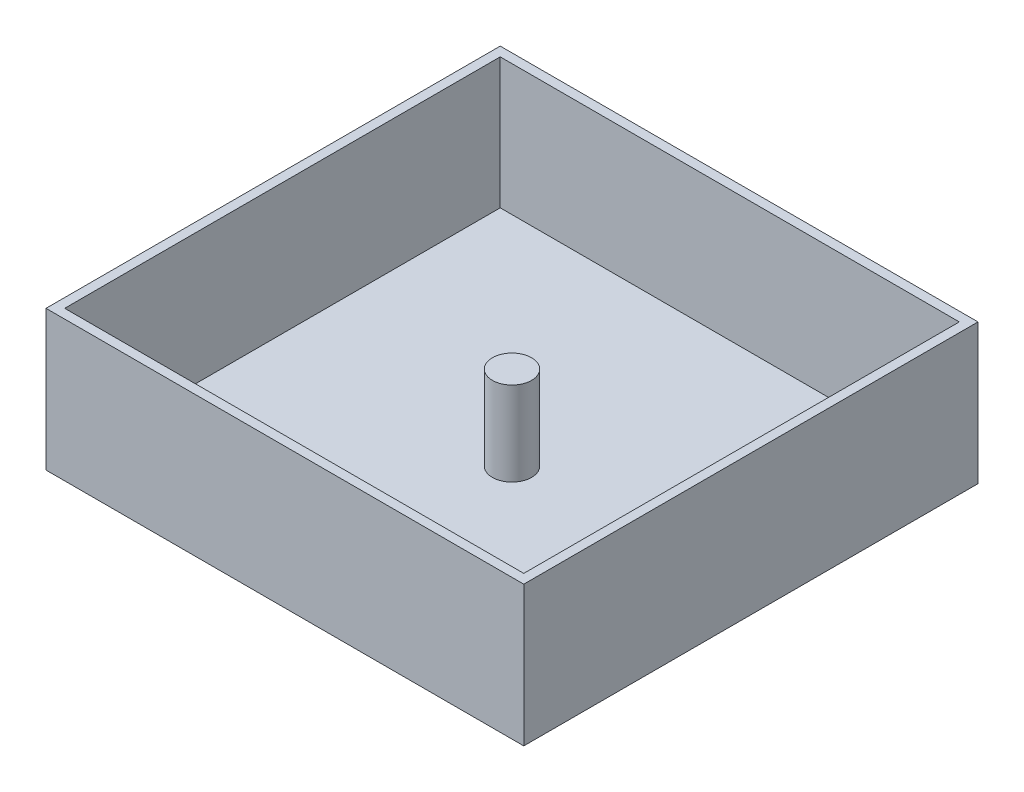
ISO-10303-21;
HEADER;
FILE_DESCRIPTION(('STEP AP214'),'2;1');
FILE_NAME('part.step','',(''),(''),'','','');
FILE_SCHEMA(('AUTOMOTIVE_DESIGN { 1 0 10303 214 1 1 1 1 }'));
ENDSEC;
DATA;
#1=APPLICATION_CONTEXT('core data for automotive mechanical design processes');
#2=APPLICATION_PROTOCOL_DEFINITION('international standard','automotive_design',2000,#1);
#3=PRODUCT_CONTEXT('',#1,'mechanical');
#4=PRODUCT('Part','Part','',(#3));
#5=PRODUCT_RELATED_PRODUCT_CATEGORY('part','',(#4));
#6=PRODUCT_DEFINITION_FORMATION('','',#4);
#7=PRODUCT_DEFINITION_CONTEXT('part definition',#1,'design');
#8=PRODUCT_DEFINITION('design','',#6,#7);
#9=PRODUCT_DEFINITION_SHAPE('','',#8);
#10=(LENGTH_UNIT() NAMED_UNIT(*) SI_UNIT(.MILLI.,.METRE.));
#11=(NAMED_UNIT(*) PLANE_ANGLE_UNIT() SI_UNIT($,.RADIAN.));
#12=(NAMED_UNIT(*) SI_UNIT($,.STERADIAN.) SOLID_ANGLE_UNIT());
#13=UNCERTAINTY_MEASURE_WITH_UNIT(LENGTH_MEASURE(1.E-05),#10,'distance_accuracy_value','');
#14=(GEOMETRIC_REPRESENTATION_CONTEXT(3) GLOBAL_UNCERTAINTY_ASSIGNED_CONTEXT((#13)) GLOBAL_UNIT_ASSIGNED_CONTEXT((#10,
#11,#12)) REPRESENTATION_CONTEXT('',''));
#15=CARTESIAN_POINT('',(0.,0.,0.));
#16=DIRECTION('',(0.,0.,1.));
#17=DIRECTION('',(1.,0.,0.));
#18=AXIS2_PLACEMENT_3D('',#15,#16,#17);
#19=CARTESIAN_POINT('',(76.7295,45.,-72.948));
#20=DIRECTION('',(-1.,0.,0.));
#21=DIRECTION('',(0.,0.,1.));
#22=AXIS2_PLACEMENT_3D('',#19,#20,#21);
#23=PLANE('',#22);
#24=DIRECTION('',(0.,0.,-1.));
#25=VECTOR('',#24,1.);
#26=CARTESIAN_POINT('',(76.7295,0.,-72.948));
#27=LINE('',#26,#25);
#28=CARTESIAN_POINT('',(76.7295,0.,72.948));
#29=VERTEX_POINT('',#28);
#30=CARTESIAN_POINT('',(76.7295,0.,-72.948));
#31=VERTEX_POINT('',#30);
#32=EDGE_CURVE('E148',#29,#31,#27,.T.);
#33=ORIENTED_EDGE('',*,*,#32,.T.);
#34=DIRECTION('',(0.,-1.,0.));
#35=VECTOR('',#34,1.);
#36=CARTESIAN_POINT('',(76.7295,45.,-72.948));
#37=LINE('',#36,#35);
#38=CARTESIAN_POINT('',(76.7295,45.,-72.948));
#39=VERTEX_POINT('',#38);
#40=EDGE_CURVE('E11',#39,#31,#37,.T.);
#41=ORIENTED_EDGE('',*,*,#40,.F.);
#42=DIRECTION('',(0.,0.,-1.));
#43=VECTOR('',#42,1.);
#44=CARTESIAN_POINT('',(76.7295,45.,-72.948));
#45=LINE('',#44,#43);
#46=CARTESIAN_POINT('',(76.7295,45.,72.948));
#47=VERTEX_POINT('',#46);
#48=EDGE_CURVE('E141',#47,#39,#45,.T.);
#49=ORIENTED_EDGE('',*,*,#48,.F.);
#50=DIRECTION('',(0.,-1.,0.));
#51=VECTOR('',#50,1.);
#52=CARTESIAN_POINT('',(76.7295,45.,72.948));
#53=LINE('',#52,#51);
#54=EDGE_CURVE('E147',#47,#29,#53,.T.);
#55=ORIENTED_EDGE('',*,*,#54,.T.);
#56=EDGE_LOOP('',(#33,#41,#49,#55));
#57=FACE_BOUND('',#56,.T.);
#58=ADVANCED_FACE('F34',(#57),#23,.F.);
#59=CARTESIAN_POINT('',(-76.7295,45.,-72.948));
#60=DIRECTION('',(0.,0.,1.));
#61=DIRECTION('',(1.,0.,0.));
#62=AXIS2_PLACEMENT_3D('',#59,#60,#61);
#63=PLANE('',#62);
#64=DIRECTION('',(-1.,0.,0.));
#65=VECTOR('',#64,1.);
#66=CARTESIAN_POINT('',(-76.7295,0.,-72.948));
#67=LINE('',#66,#65);
#68=CARTESIAN_POINT('',(-76.7295,0.,-72.948));
#69=VERTEX_POINT('',#68);
#70=EDGE_CURVE('E151',#31,#69,#67,.T.);
#71=ORIENTED_EDGE('',*,*,#70,.T.);
#72=DIRECTION('',(0.,-1.,0.));
#73=VECTOR('',#72,1.);
#74=CARTESIAN_POINT('',(-76.7295,45.,-72.948));
#75=LINE('',#74,#73);
#76=CARTESIAN_POINT('',(-76.7295,45.,-72.948));
#77=VERTEX_POINT('',#76);
#78=EDGE_CURVE('E41',#77,#69,#75,.T.);
#79=ORIENTED_EDGE('',*,*,#78,.F.);
#80=DIRECTION('',(-1.,0.,0.));
#81=VECTOR('',#80,1.);
#82=CARTESIAN_POINT('',(-76.7295,45.,-72.948));
#83=LINE('',#82,#81);
#84=EDGE_CURVE('E85',#39,#77,#83,.T.);
#85=ORIENTED_EDGE('',*,*,#84,.F.);
#86=ORIENTED_EDGE('',*,*,#40,.T.);
#87=EDGE_LOOP('',(#71,#79,#85,#86));
#88=FACE_BOUND('',#87,.T.);
#89=ADVANCED_FACE('F180',(#88),#63,.F.);
#90=CARTESIAN_POINT('',(-76.7295,45.,-72.948));
#91=DIRECTION('',(1.,0.,0.));
#92=DIRECTION('',(0.,0.,-1.));
#93=AXIS2_PLACEMENT_3D('',#90,#91,#92);
#94=PLANE('',#93);
#95=DIRECTION('',(0.,0.,1.));
#96=VECTOR('',#95,1.);
#97=CARTESIAN_POINT('',(-76.7295,0.,-72.948));
#98=LINE('',#97,#96);
#99=CARTESIAN_POINT('',(-76.7295,0.,72.948));
#100=VERTEX_POINT('',#99);
#101=EDGE_CURVE('E153',#69,#100,#98,.T.);
#102=ORIENTED_EDGE('',*,*,#101,.T.);
#103=DIRECTION('',(0.,-1.,0.));
#104=VECTOR('',#103,1.);
#105=CARTESIAN_POINT('',(-76.7295,45.,72.948));
#106=LINE('',#105,#104);
#107=CARTESIAN_POINT('',(-76.7295,45.,72.948));
#108=VERTEX_POINT('',#107);
#109=EDGE_CURVE('E157',#108,#100,#106,.T.);
#110=ORIENTED_EDGE('',*,*,#109,.F.);
#111=DIRECTION('',(0.,0.,1.));
#112=VECTOR('',#111,1.);
#113=CARTESIAN_POINT('',(-76.7295,45.,-72.948));
#114=LINE('',#113,#112);
#115=EDGE_CURVE('E144',#77,#108,#114,.T.);
#116=ORIENTED_EDGE('',*,*,#115,.F.);
#117=ORIENTED_EDGE('',*,*,#78,.T.);
#118=EDGE_LOOP('',(#102,#110,#116,#117));
#119=FACE_BOUND('',#118,.T.);
#120=ADVANCED_FACE('F162',(#119),#94,.F.);
#121=CARTESIAN_POINT('',(-76.7295,45.,72.948));
#122=DIRECTION('',(0.,0.,-1.));
#123=DIRECTION('',(-1.,0.,0.));
#124=AXIS2_PLACEMENT_3D('',#121,#122,#123);
#125=PLANE('',#124);
#126=DIRECTION('',(1.,0.,0.));
#127=VECTOR('',#126,1.);
#128=CARTESIAN_POINT('',(-76.7295,0.,72.948));
#129=LINE('',#128,#127);
#130=EDGE_CURVE('E78',#100,#29,#129,.T.);
#131=ORIENTED_EDGE('',*,*,#130,.T.);
#132=ORIENTED_EDGE('',*,*,#54,.F.);
#133=DIRECTION('',(1.,0.,0.));
#134=VECTOR('',#133,1.);
#135=CARTESIAN_POINT('',(-76.7295,45.,72.948));
#136=LINE('',#135,#134);
#137=EDGE_CURVE('E57',#108,#47,#136,.T.);
#138=ORIENTED_EDGE('',*,*,#137,.F.);
#139=ORIENTED_EDGE('',*,*,#109,.T.);
#140=EDGE_LOOP('',(#131,#132,#138,#139));
#141=FACE_BOUND('',#140,.T.);
#142=ADVANCED_FACE('F170',(#141),#125,.F.);
#143=CARTESIAN_POINT('',(0.,45.,0.));
#144=DIRECTION('',(0.,1.,0.));
#145=DIRECTION('',(0.,0.,1.));
#146=AXIS2_PLACEMENT_3D('',#143,#144,#145);
#147=PLANE('',#146);
#148=DIRECTION('',(0.,0.,-1.));
#149=VECTOR('',#148,1.);
#150=CARTESIAN_POINT('',(73.7295,45.,-72.948));
#151=LINE('',#150,#149);
#152=CARTESIAN_POINT('',(73.7295,45.,69.948));
#153=VERTEX_POINT('',#152);
#154=CARTESIAN_POINT('',(73.7295,45.,-69.948));
#155=VERTEX_POINT('',#154);
#156=EDGE_CURVE('E130',#153,#155,#151,.T.);
#157=ORIENTED_EDGE('',*,*,#156,.F.);
#158=DIRECTION('',(1.,0.,0.));
#159=VECTOR('',#158,1.);
#160=CARTESIAN_POINT('',(-76.7295,45.,69.948));
#161=LINE('',#160,#159);
#162=CARTESIAN_POINT('',(-73.7295,45.,69.948));
#163=VERTEX_POINT('',#162);
#164=EDGE_CURVE('E139',#163,#153,#161,.T.);
#165=ORIENTED_EDGE('',*,*,#164,.F.);
#166=DIRECTION('',(0.,0.,1.));
#167=VECTOR('',#166,1.);
#168=CARTESIAN_POINT('',(-73.7295,45.,-72.948));
#169=LINE('',#168,#167);
#170=CARTESIAN_POINT('',(-73.7295,45.,-69.948));
#171=VERTEX_POINT('',#170);
#172=EDGE_CURVE('E137',#171,#163,#169,.T.);
#173=ORIENTED_EDGE('',*,*,#172,.F.);
#174=DIRECTION('',(-1.,0.,0.));
#175=VECTOR('',#174,1.);
#176=CARTESIAN_POINT('',(-76.7295,45.,-69.948));
#177=LINE('',#176,#175);
#178=EDGE_CURVE('E122',#155,#171,#177,.T.);
#179=ORIENTED_EDGE('',*,*,#178,.F.);
#180=EDGE_LOOP('',(#157,#165,#173,#179));
#181=FACE_BOUND('',#180,.T.);
#182=ORIENTED_EDGE('',*,*,#48,.T.);
#183=ORIENTED_EDGE('',*,*,#84,.T.);
#184=ORIENTED_EDGE('',*,*,#115,.T.);
#185=ORIENTED_EDGE('',*,*,#137,.T.);
#186=EDGE_LOOP('',(#182,#183,#184,#185));
#187=FACE_BOUND('',#186,.T.);
#188=ADVANCED_FACE('F172',(#181,#187),#147,.T.);
#189=CARTESIAN_POINT('',(0.,0.,0.));
#190=DIRECTION('',(0.,1.,0.));
#191=DIRECTION('',(0.,0.,1.));
#192=AXIS2_PLACEMENT_3D('',#189,#190,#191);
#193=PLANE('',#192);
#194=ORIENTED_EDGE('',*,*,#32,.F.);
#195=ORIENTED_EDGE('',*,*,#130,.F.);
#196=ORIENTED_EDGE('',*,*,#101,.F.);
#197=ORIENTED_EDGE('',*,*,#70,.F.);
#198=EDGE_LOOP('',(#194,#195,#196,#197));
#199=FACE_BOUND('',#198,.T.);
#200=ADVANCED_FACE('F166',(#199),#193,.F.);
#201=CARTESIAN_POINT('',(73.7295,45.,-72.948));
#202=DIRECTION('',(-1.,0.,0.));
#203=DIRECTION('',(0.,0.,1.));
#204=AXIS2_PLACEMENT_3D('',#201,#202,#203);
#205=PLANE('',#204);
#206=DIRECTION('',(0.,0.,-1.));
#207=VECTOR('',#206,1.);
#208=CARTESIAN_POINT('',(73.7295,3.,-72.948));
#209=LINE('',#208,#207);
#210=CARTESIAN_POINT('',(73.7295,3.,69.948));
#211=VERTEX_POINT('',#210);
#212=CARTESIAN_POINT('',(73.7295,3.,-69.948));
#213=VERTEX_POINT('',#212);
#214=EDGE_CURVE('E113',#211,#213,#209,.T.);
#215=ORIENTED_EDGE('',*,*,#214,.F.);
#216=DIRECTION('',(0.,-1.,0.));
#217=VECTOR('',#216,1.);
#218=CARTESIAN_POINT('',(73.7295,45.,69.948));
#219=LINE('',#218,#217);
#220=EDGE_CURVE('E133',#153,#211,#219,.T.);
#221=ORIENTED_EDGE('',*,*,#220,.F.);
#222=ORIENTED_EDGE('',*,*,#156,.T.);
#223=DIRECTION('',(0.,-1.,0.));
#224=VECTOR('',#223,1.);
#225=CARTESIAN_POINT('',(73.7295,45.,-69.948));
#226=LINE('',#225,#224);
#227=EDGE_CURVE('E125',#155,#213,#226,.T.);
#228=ORIENTED_EDGE('',*,*,#227,.T.);
#229=EDGE_LOOP('',(#215,#221,#222,#228));
#230=FACE_BOUND('',#229,.T.);
#231=ADVANCED_FACE('F213',(#230),#205,.T.);
#232=CARTESIAN_POINT('',(-76.7295,45.,-69.948));
#233=DIRECTION('',(0.,0.,1.));
#234=DIRECTION('',(1.,0.,0.));
#235=AXIS2_PLACEMENT_3D('',#232,#233,#234);
#236=PLANE('',#235);
#237=DIRECTION('',(-1.,0.,0.));
#238=VECTOR('',#237,1.);
#239=CARTESIAN_POINT('',(-76.7295,3.,-69.948));
#240=LINE('',#239,#238);
#241=CARTESIAN_POINT('',(-73.7295,3.,-69.948));
#242=VERTEX_POINT('',#241);
#243=EDGE_CURVE('E107',#213,#242,#240,.T.);
#244=ORIENTED_EDGE('',*,*,#243,.F.);
#245=ORIENTED_EDGE('',*,*,#227,.F.);
#246=ORIENTED_EDGE('',*,*,#178,.T.);
#247=DIRECTION('',(0.,-1.,0.));
#248=VECTOR('',#247,1.);
#249=CARTESIAN_POINT('',(-73.7295,45.,-69.948));
#250=LINE('',#249,#248);
#251=EDGE_CURVE('E119',#171,#242,#250,.T.);
#252=ORIENTED_EDGE('',*,*,#251,.T.);
#253=EDGE_LOOP('',(#244,#245,#246,#252));
#254=FACE_BOUND('',#253,.T.);
#255=ADVANCED_FACE('F120',(#254),#236,.T.);
#256=CARTESIAN_POINT('',(-73.7295,45.,-72.948));
#257=DIRECTION('',(1.,0.,0.));
#258=DIRECTION('',(0.,0.,-1.));
#259=AXIS2_PLACEMENT_3D('',#256,#257,#258);
#260=PLANE('',#259);
#261=DIRECTION('',(0.,0.,1.));
#262=VECTOR('',#261,1.);
#263=CARTESIAN_POINT('',(-73.7295,3.,-72.948));
#264=LINE('',#263,#262);
#265=CARTESIAN_POINT('',(-73.7295,3.,69.948));
#266=VERTEX_POINT('',#265);
#267=EDGE_CURVE('E111',#242,#266,#264,.T.);
#268=ORIENTED_EDGE('',*,*,#267,.F.);
#269=ORIENTED_EDGE('',*,*,#251,.F.);
#270=ORIENTED_EDGE('',*,*,#172,.T.);
#271=DIRECTION('',(0.,-1.,0.));
#272=VECTOR('',#271,1.);
#273=CARTESIAN_POINT('',(-73.7295,45.,69.948));
#274=LINE('',#273,#272);
#275=EDGE_CURVE('E48',#163,#266,#274,.T.);
#276=ORIENTED_EDGE('',*,*,#275,.T.);
#277=EDGE_LOOP('',(#268,#269,#270,#276));
#278=FACE_BOUND('',#277,.T.);
#279=ADVANCED_FACE('F127',(#278),#260,.T.);
#280=CARTESIAN_POINT('',(-76.7295,45.,69.948));
#281=DIRECTION('',(0.,0.,-1.));
#282=DIRECTION('',(-1.,0.,0.));
#283=AXIS2_PLACEMENT_3D('',#280,#281,#282);
#284=PLANE('',#283);
#285=DIRECTION('',(1.,0.,0.));
#286=VECTOR('',#285,1.);
#287=CARTESIAN_POINT('',(-76.7295,3.,69.948));
#288=LINE('',#287,#286);
#289=EDGE_CURVE('E128',#266,#211,#288,.T.);
#290=ORIENTED_EDGE('',*,*,#289,.F.);
#291=ORIENTED_EDGE('',*,*,#275,.F.);
#292=ORIENTED_EDGE('',*,*,#164,.T.);
#293=ORIENTED_EDGE('',*,*,#220,.T.);
#294=EDGE_LOOP('',(#290,#291,#292,#293));
#295=FACE_BOUND('',#294,.T.);
#296=ADVANCED_FACE('F238',(#295),#284,.T.);
#297=CARTESIAN_POINT('',(0.,3.,0.));
#298=DIRECTION('',(0.,1.,0.));
#299=DIRECTION('',(0.,0.,1.));
#300=AXIS2_PLACEMENT_3D('',#297,#298,#299);
#301=PLANE('',#300);
#302=CARTESIAN_POINT('',(0.,3.,0.));
#303=DIRECTION('',(0.,1.,0.));
#304=DIRECTION('',(0.,0.,1.));
#305=AXIS2_PLACEMENT_3D('',#302,#303,#304);
#306=CIRCLE('',#305,6.3);
#307=CARTESIAN_POINT('',(0.,3.,-6.3));
#308=VERTEX_POINT('',#307);
#309=EDGE_CURVE('E282',#308,#308,#306,.T.);
#310=ORIENTED_EDGE('',*,*,#309,.F.);
#311=EDGE_LOOP('',(#310));
#312=FACE_BOUND('',#311,.T.);
#313=ORIENTED_EDGE('',*,*,#214,.T.);
#314=ORIENTED_EDGE('',*,*,#243,.T.);
#315=ORIENTED_EDGE('',*,*,#267,.T.);
#316=ORIENTED_EDGE('',*,*,#289,.T.);
#317=EDGE_LOOP('',(#313,#314,#315,#316));
#318=FACE_BOUND('',#317,.T.);
#319=ADVANCED_FACE('F109',(#312,#318),#301,.T.);
#320=CARTESIAN_POINT('',(0.,30.,0.));
#321=DIRECTION('',(0.,-1.,0.));
#322=DIRECTION('',(0.,0.,-1.));
#323=AXIS2_PLACEMENT_3D('',#320,#321,#322);
#324=CYLINDRICAL_SURFACE('',#323,6.3);
#325=CARTESIAN_POINT('',(0.,30.,0.));
#326=DIRECTION('',(0.,1.,0.));
#327=DIRECTION('',(0.,0.,1.));
#328=AXIS2_PLACEMENT_3D('',#325,#326,#327);
#329=CIRCLE('',#328,6.3);
#330=CARTESIAN_POINT('',(0.,30.,-6.3));
#331=VERTEX_POINT('',#330);
#332=EDGE_CURVE('E281',#331,#331,#329,.T.);
#333=CARTESIAN_POINT('',(0.,30.,-6.3));
#334=CARTESIAN_POINT('',(0.,29.71875,-6.3));
#335=CARTESIAN_POINT('',(0.,29.4375,-6.3));
#336=CARTESIAN_POINT('',(0.,28.875,-6.3));
#337=CARTESIAN_POINT('',(0.,28.59375,-6.3));
#338=CARTESIAN_POINT('',(0.,28.03125,-6.3));
#339=CARTESIAN_POINT('',(0.,27.75,-6.3));
#340=CARTESIAN_POINT('',(0.,27.1875,-6.3));
#341=CARTESIAN_POINT('',(0.,26.90625,-6.3));
#342=CARTESIAN_POINT('',(0.,26.34375,-6.3));
#343=CARTESIAN_POINT('',(0.,26.0625,-6.3));
#344=CARTESIAN_POINT('',(0.,25.5,-6.3));
#345=CARTESIAN_POINT('',(0.,25.21875,-6.3));
#346=CARTESIAN_POINT('',(0.,24.65625,-6.3));
#347=CARTESIAN_POINT('',(0.,24.375,-6.3));
#348=CARTESIAN_POINT('',(0.,23.8125,-6.3));
#349=CARTESIAN_POINT('',(0.,23.53125,-6.3));
#350=CARTESIAN_POINT('',(0.,22.96875,-6.3));
#351=CARTESIAN_POINT('',(0.,22.6875,-6.3));
#352=CARTESIAN_POINT('',(0.,22.125,-6.3));
#353=CARTESIAN_POINT('',(0.,21.84375,-6.3));
#354=CARTESIAN_POINT('',(0.,21.28125,-6.3));
#355=CARTESIAN_POINT('',(0.,21.,-6.3));
#356=CARTESIAN_POINT('',(0.,20.4375,-6.3));
#357=CARTESIAN_POINT('',(0.,20.15625,-6.3));
#358=CARTESIAN_POINT('',(0.,19.59375,-6.3));
#359=CARTESIAN_POINT('',(0.,19.3125,-6.3));
#360=CARTESIAN_POINT('',(0.,18.75,-6.3));
#361=CARTESIAN_POINT('',(0.,18.46875,-6.3));
#362=CARTESIAN_POINT('',(0.,17.90625,-6.3));
#363=CARTESIAN_POINT('',(0.,17.625,-6.3));
#364=CARTESIAN_POINT('',(0.,17.0625,-6.3));
#365=CARTESIAN_POINT('',(0.,16.78125,-6.3));
#366=CARTESIAN_POINT('',(0.,16.21875,-6.3));
#367=CARTESIAN_POINT('',(0.,15.9375,-6.3));
#368=CARTESIAN_POINT('',(0.,15.375,-6.3));
#369=CARTESIAN_POINT('',(0.,15.09375,-6.3));
#370=CARTESIAN_POINT('',(0.,14.53125,-6.3));
#371=CARTESIAN_POINT('',(0.,14.25,-6.3));
#372=CARTESIAN_POINT('',(0.,13.6875,-6.3));
#373=CARTESIAN_POINT('',(0.,13.40625,-6.3));
#374=CARTESIAN_POINT('',(0.,12.84375,-6.3));
#375=CARTESIAN_POINT('',(0.,12.5625,-6.3));
#376=CARTESIAN_POINT('',(0.,12.,-6.3));
#377=CARTESIAN_POINT('',(0.,11.71875,-6.3));
#378=CARTESIAN_POINT('',(0.,11.15625,-6.3));
#379=CARTESIAN_POINT('',(0.,10.875,-6.3));
#380=CARTESIAN_POINT('',(0.,10.3125,-6.3));
#381=CARTESIAN_POINT('',(0.,10.03125,-6.3));
#382=CARTESIAN_POINT('',(0.,9.46875,-6.3));
#383=CARTESIAN_POINT('',(0.,9.1875,-6.3));
#384=CARTESIAN_POINT('',(0.,8.625,-6.3));
#385=CARTESIAN_POINT('',(0.,8.34375,-6.3));
#386=CARTESIAN_POINT('',(0.,7.78125,-6.3));
#387=CARTESIAN_POINT('',(0.,7.5,-6.3));
#388=CARTESIAN_POINT('',(0.,6.9375,-6.3));
#389=CARTESIAN_POINT('',(0.,6.65625,-6.3));
#390=CARTESIAN_POINT('',(0.,6.09375,-6.3));
#391=CARTESIAN_POINT('',(0.,5.8125,-6.3));
#392=CARTESIAN_POINT('',(0.,5.25,-6.3));
#393=CARTESIAN_POINT('',(0.,4.96875,-6.3));
#394=CARTESIAN_POINT('',(0.,4.40625,-6.3));
#395=CARTESIAN_POINT('',(0.,4.125,-6.3));
#396=CARTESIAN_POINT('',(0.,3.5625,-6.3));
#397=CARTESIAN_POINT('',(0.,3.28125,-6.3));
#398=CARTESIAN_POINT('',(0.,3.,-6.3));
#399=B_SPLINE_CURVE_WITH_KNOTS('',3,(#333,#334,#335,#336,#337,#338,#339,#340,#341,#342,#343,
#344,#345,#346,#347,#348,#349,#350,#351,#352,#353,#354,#355,#356,#357,#358,#359,#360,#361,#362,
#363,#364,#365,#366,#367,#368,#369,#370,#371,#372,#373,#374,#375,#376,#377,#378,#379,#380,#381,
#382,#383,#384,#385,#386,#387,#388,#389,#390,#391,#392,#393,#394,#395,#396,#397,#398),
.UNSPECIFIED.,.F.,.F.,(4,2,2,2,2,2,2,2,2,2,2,2,2,2,2,2,2,2,2,2,2,2,2,2,2,2,2,2,2,2,2,2,4),(0.,
0.843750000000001,1.6875,2.53125,3.375,4.21875,5.0625,5.90625,6.75,7.59375,8.4375,9.28125,
10.125,10.96875,11.8125,12.65625,13.5,14.34375,15.1875,16.03125,16.875,17.71875,18.5625,
19.40625,20.25,21.09375,21.9375,22.78125,23.625,24.46875,25.3125,26.15625,27.),.UNSPECIFIED.);
#400=EDGE_CURVE('BSEAM255',#331,#308,#399,.T.);
#401=ORIENTED_EDGE('',*,*,#332,.F.);
#402=ORIENTED_EDGE('',*,*,#309,.T.);
#403=ORIENTED_EDGE('',*,*,#400,.T.);
#404=ORIENTED_EDGE('',*,*,#400,.F.);
#405=EDGE_LOOP('',(#401,#403,#402,#404));
#406=FACE_BOUND('',#405,.T.);
#407=ADVANCED_FACE('F255',(#406),#324,.T.);
#408=CARTESIAN_POINT('',(0.,30.,0.));
#409=DIRECTION('',(0.,1.,0.));
#410=DIRECTION('',(0.,0.,1.));
#411=AXIS2_PLACEMENT_3D('',#408,#409,#410);
#412=PLANE('',#411);
#413=ORIENTED_EDGE('',*,*,#332,.T.);
#414=EDGE_LOOP('',(#413));
#415=FACE_BOUND('',#414,.T.);
#416=ADVANCED_FACE('F265',(#415),#412,.T.);
#417=CLOSED_SHELL('',(#58,#89,#120,#142,#188,#200,#231,#255,#279,#296,#319,#407,#416));
#418=MANIFOLD_SOLID_BREP('B2',#417);
#419=ADVANCED_BREP_SHAPE_REPRESENTATION('',(#18,#418),#14);
#420=SHAPE_DEFINITION_REPRESENTATION(#9,#419);
ENDSEC;
END-ISO-10303-21;
